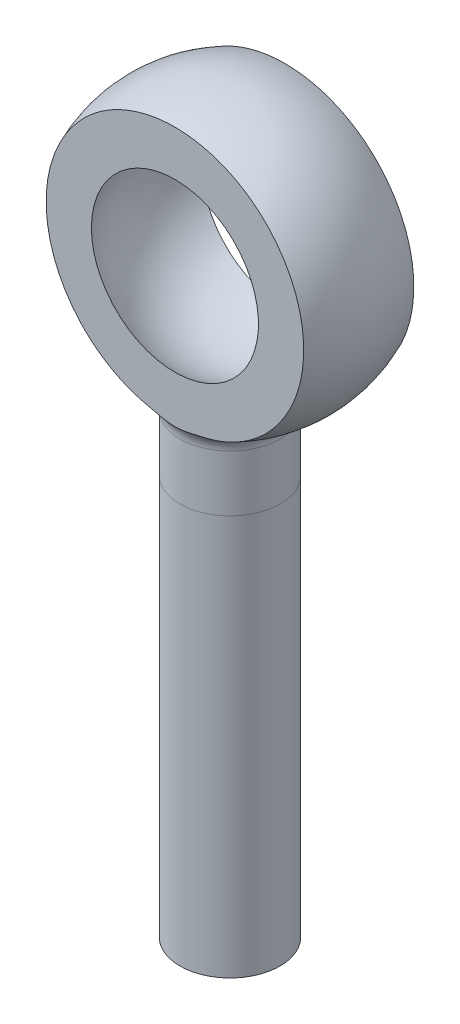
ISO-10303-21;
HEADER;
FILE_DESCRIPTION(('STEP AP214'),'2;1');
FILE_NAME('part.step','',(''),(''),'','','');
FILE_SCHEMA(('AUTOMOTIVE_DESIGN { 1 0 10303 214 1 1 1 1 }'));
ENDSEC;
DATA;
#1=APPLICATION_CONTEXT('core data for automotive mechanical design processes');
#2=APPLICATION_PROTOCOL_DEFINITION('international standard','automotive_design',2000,#1);
#3=PRODUCT_CONTEXT('',#1,'mechanical');
#4=PRODUCT('Part','Part','',(#3));
#5=PRODUCT_RELATED_PRODUCT_CATEGORY('part','',(#4));
#6=PRODUCT_DEFINITION_FORMATION('','',#4);
#7=PRODUCT_DEFINITION_CONTEXT('part definition',#1,'design');
#8=PRODUCT_DEFINITION('design','',#6,#7);
#9=PRODUCT_DEFINITION_SHAPE('','',#8);
#10=(LENGTH_UNIT() NAMED_UNIT(*) SI_UNIT(.MILLI.,.METRE.));
#11=(NAMED_UNIT(*) PLANE_ANGLE_UNIT() SI_UNIT($,.RADIAN.));
#12=(NAMED_UNIT(*) SI_UNIT($,.STERADIAN.) SOLID_ANGLE_UNIT());
#13=UNCERTAINTY_MEASURE_WITH_UNIT(LENGTH_MEASURE(1.E-05),#10,'distance_accuracy_value','');
#14=(GEOMETRIC_REPRESENTATION_CONTEXT(3) GLOBAL_UNCERTAINTY_ASSIGNED_CONTEXT((#13)) GLOBAL_UNIT_ASSIGNED_CONTEXT((#10,
#11,#12)) REPRESENTATION_CONTEXT('',''));
#15=CARTESIAN_POINT('',(0.,0.,0.));
#16=DIRECTION('',(0.,0.,1.));
#17=DIRECTION('',(1.,0.,0.));
#18=AXIS2_PLACEMENT_3D('',#15,#16,#17);
#19=CARTESIAN_POINT('',(0.,11.1135,0.));
#20=DIRECTION('',(0.,-1.,0.));
#21=DIRECTION('',(0.,0.,-1.));
#22=AXIS2_PLACEMENT_3D('',#19,#20,#21);
#23=CYLINDRICAL_SURFACE('',#22,3.96875);
#24=CARTESIAN_POINT('',(0.,-47.625,0.));
#25=DIRECTION('',(0.,1.,0.));
#26=DIRECTION('',(0.,0.,1.));
#27=AXIS2_PLACEMENT_3D('',#24,#25,#26);
#28=CIRCLE('',#27,3.96875);
#29=CARTESIAN_POINT('',(0.,-47.625,3.96875));
#30=VERTEX_POINT('',#29);
#31=EDGE_CURVE('E78',#30,#30,#28,.T.);
#32=ORIENTED_EDGE('',*,*,#31,.T.);
#33=EDGE_LOOP('',(#32));
#34=FACE_BOUND('',#33,.T.);
#35=CARTESIAN_POINT('',(0.,-15.875,0.));
#36=DIRECTION('',(0.,1.,0.));
#37=DIRECTION('',(0.,0.,1.));
#38=AXIS2_PLACEMENT_3D('',#35,#36,#37);
#39=CIRCLE('',#38,3.96875);
#40=CARTESIAN_POINT('',(0.,-15.875,3.96875));
#41=VERTEX_POINT('',#40);
#42=EDGE_CURVE('E11',#41,#41,#39,.T.);
#43=ORIENTED_EDGE('',*,*,#42,.F.);
#44=EDGE_LOOP('',(#43));
#45=FACE_BOUND('',#44,.T.);
#46=ADVANCED_FACE('F33',(#34,#45),#23,.T.);
#47=CARTESIAN_POINT('',(0.,0.,0.));
#48=DIRECTION('',(0.,-1.,0.));
#49=DIRECTION('',(1.,0.,0.));
#50=AXIS2_PLACEMENT_3D('',#47,#48,#49);
#51=SPHERICAL_SURFACE('',#50,11.1125);
#52=CARTESIAN_POINT('',(0.,-9.99256458802736,0.));
#53=DIRECTION('',(0.,1.,0.));
#54=DIRECTION('',(0.,0.,1.));
#55=AXIS2_PLACEMENT_3D('',#52,#53,#54);
#56=CIRCLE('',#55,4.86171875);
#57=CARTESIAN_POINT('',(-2.13304846735876,-9.99256458802736,-4.3688));
#58=VERTEX_POINT('',#57);
#59=CARTESIAN_POINT('',(-2.13304846735876,-9.99256458802736,4.3688));
#60=VERTEX_POINT('',#59);
#61=EDGE_CURVE('E43',#58,#60,#56,.T.);
#62=ORIENTED_EDGE('',*,*,#61,.T.);
#63=CARTESIAN_POINT('',(0.,0.,4.3688));
#64=DIRECTION('',(0.,0.,-1.));
#65=DIRECTION('',(-1.,0.,0.));
#66=AXIS2_PLACEMENT_3D('',#63,#64,#65);
#67=CIRCLE('',#66,10.2176926363049);
#68=CARTESIAN_POINT('',(2.13304846735876,-9.99256458802736,4.3688));
#69=VERTEX_POINT('',#68);
#70=EDGE_CURVE('E49',#60,#69,#67,.T.);
#71=ORIENTED_EDGE('',*,*,#70,.T.);
#72=CARTESIAN_POINT('',(2.13304846735876,-9.99256458802736,-4.3688));
#73=VERTEX_POINT('',#72);
#74=EDGE_CURVE('E56',#69,#73,#56,.T.);
#75=ORIENTED_EDGE('',*,*,#74,.T.);
#76=CARTESIAN_POINT('',(0.,0.,-4.3688));
#77=DIRECTION('',(0.,0.,1.));
#78=DIRECTION('',(1.,0.,0.));
#79=AXIS2_PLACEMENT_3D('',#76,#77,#78);
#80=CIRCLE('',#79,10.2176926363049);
#81=EDGE_CURVE('E132',#73,#58,#80,.T.);
#82=ORIENTED_EDGE('',*,*,#81,.T.);
#83=EDGE_LOOP('',(#62,#71,#75,#82));
#84=FACE_BOUND('',#83,.T.);
#85=ADVANCED_FACE('F69',(#84),#51,.T.);
#86=ORIENTED_EDGE('',*,*,#42,.T.);
#87=EDGE_LOOP('',(#86));
#88=FACE_BOUND('',#87,.T.);
#89=CARTESIAN_POINT('',(0.,-11.4200738148884,0.));
#90=DIRECTION('',(0.,1.,0.));
#91=DIRECTION('',(0.,0.,1.));
#92=AXIS2_PLACEMENT_3D('',#89,#90,#91);
#93=CIRCLE('',#92,3.96875);
#94=CARTESIAN_POINT('',(0.,-11.4200738148884,3.96875));
#95=VERTEX_POINT('',#94);
#96=EDGE_CURVE('E75',#95,#95,#93,.F.);
#97=ORIENTED_EDGE('',*,*,#96,.T.);
#98=EDGE_LOOP('',(#97));
#99=FACE_BOUND('',#98,.T.);
#100=ADVANCED_FACE('F100',(#88,#99),#23,.T.);
#101=CARTESIAN_POINT('',(0.,-47.625,0.));
#102=DIRECTION('',(0.,1.,0.));
#103=DIRECTION('',(0.,0.,1.));
#104=AXIS2_PLACEMENT_3D('',#101,#102,#103);
#105=PLANE('',#104);
#106=ORIENTED_EDGE('',*,*,#31,.F.);
#107=EDGE_LOOP('',(#106));
#108=FACE_BOUND('',#107,.T.);
#109=ADVANCED_FACE('F109',(#108),#105,.F.);
#110=CARTESIAN_POINT('',(0.,-11.4200738148884,0.));
#111=DIRECTION('',(0.,1.,0.));
#112=DIRECTION('',(0.,0.,1.));
#113=AXIS2_PLACEMENT_3D('',#110,#111,#112);
#114=TOROIDAL_SURFACE('',#113,5.55625,1.5875);
#115=ORIENTED_EDGE('',*,*,#74,.F.);
#116=CARTESIAN_POINT('',(0.,-10.3664520860407,4.3688));
#117=CARTESIAN_POINT('',(-0.0726097240498486,-10.3664573067879,4.3688));
#118=CARTESIAN_POINT('',(-0.145213118950749,-10.3643980280305,4.3688));
#119=CARTESIAN_POINT('',(-0.290206118978634,-10.3563495762766,4.3688));
#120=CARTESIAN_POINT('',(-0.362595700810238,-10.3503599898575,4.3688));
#121=CARTESIAN_POINT('',(-0.579547925017426,-10.3270979445272,4.3688));
#122=CARTESIAN_POINT('',(-0.723534377132135,-10.304535777483,4.3688));
#123=CARTESIAN_POINT('',(-1.01235068782425,-10.2503532361437,4.3688));
#124=CARTESIAN_POINT('',(-1.15714826594501,-10.2185755951878,4.3688));
#125=CARTESIAN_POINT('',(-1.4458760076199,-10.1519613683551,4.3688));
#126=CARTESIAN_POINT('',(-1.5898067729567,-10.1171272525233,4.3688));
#127=CARTESIAN_POINT('',(-1.88336382291367,-10.0477989083918,4.3688));
#128=CARTESIAN_POINT('',(-2.03300587111503,-10.0133637157854,4.3688));
#129=CARTESIAN_POINT('',(-2.33355404774908,-9.95054289068798,4.3688));
#130=CARTESIAN_POINT('',(-2.48446071136984,-9.92215996946775,4.3688));
#131=CARTESIAN_POINT('',(-2.93648023819684,-9.85253925716706,4.3688));
#132=CARTESIAN_POINT('',(-3.24062822955834,-9.82573776245045,4.3688));
#133=CARTESIAN_POINT('',(-3.6769915806545,-9.83774472619492,4.3688));
#134=CARTESIAN_POINT('',(-3.80987191493173,-9.8481668469335,4.3688));
#135=CARTESIAN_POINT('',(-4.07384562707482,-9.8854988906792,4.3688));
#136=CARTESIAN_POINT('',(-4.20493266157021,-9.91245682091621,4.3688));
#137=CARTESIAN_POINT('',(-4.46313869176347,-9.98626860579402,4.3688));
#138=CARTESIAN_POINT('',(-4.59019753900849,-10.0333398489889,4.3688));
#139=CARTESIAN_POINT('',(-4.83339328619368,-10.1501109535123,4.3688));
#140=CARTESIAN_POINT('',(-4.94956575816893,-10.2197335473519,4.3688));
#141=CARTESIAN_POINT('',(-5.12613585560653,-10.3542209834351,4.3688));
#142=CARTESIAN_POINT('',(-5.19180229601023,-10.4121857719334,4.3688));
#143=CARTESIAN_POINT('',(-5.31300705472184,-10.5379861621544,4.3688));
#144=CARTESIAN_POINT('',(-5.36854817538428,-10.6058190233465,4.3688));
#145=CARTESIAN_POINT('',(-5.46711361642322,-10.7509471565449,4.3688));
#146=CARTESIAN_POINT('',(-5.51003207551035,-10.8283151412905,4.3688));
#147=CARTESIAN_POINT('',(-5.5799656949474,-10.9899542373251,4.3688));
#148=CARTESIAN_POINT('',(-5.60699511611798,-11.0742190808679,4.3688));
#149=CARTESIAN_POINT('',(-5.64082513352901,-11.2352821106631,4.3688));
#150=CARTESIAN_POINT('',(-5.64979816330322,-11.3116274513772,4.3688));
#151=CARTESIAN_POINT('',(-5.65368138311477,-11.4646605220079,4.3688));
#152=CARTESIAN_POINT('',(-5.64859811289931,-11.5413480761333,4.3688));
#153=CARTESIAN_POINT('',(-5.62558138875317,-11.6869659944006,4.3688));
#154=CARTESIAN_POINT('',(-5.60861702913061,-11.7560529616344,4.3688));
#155=CARTESIAN_POINT('',(-5.56377038655413,-11.8905697022908,4.3688));
#156=CARTESIAN_POINT('',(-5.53588682722717,-11.9559990471423,4.3688));
#157=CARTESIAN_POINT('',(-5.46912287513845,-12.0843822802058,4.3688));
#158=CARTESIAN_POINT('',(-5.42983867272598,-12.1471248573844,4.3688));
#159=CARTESIAN_POINT('',(-5.34247234969647,-12.2660912762876,4.3688));
#160=CARTESIAN_POINT('',(-5.29438936731948,-12.3223144786173,4.3688));
#161=CARTESIAN_POINT('',(-5.18421657107587,-12.4347107931678,4.3688));
#162=CARTESIAN_POINT('',(-5.12111489607715,-12.4898888614347,4.3688));
#163=CARTESIAN_POINT('',(-4.98790082669363,-12.5910730708791,4.3688));
#164=CARTESIAN_POINT('',(-4.91777768435069,-12.637064817836,4.3688));
#165=CARTESIAN_POINT('',(-4.73097256822164,-12.7437229251406,4.3688));
#166=CARTESIAN_POINT('',(-4.61051068614924,-12.797838692947,4.3688));
#167=CARTESIAN_POINT('',(-4.42485814422583,-12.8639106010932,4.3688));
#168=CARTESIAN_POINT('',(-4.36214278162483,-12.8834184497696,4.3688));
#169=CARTESIAN_POINT('',(-4.23544549898304,-12.9177982572151,4.3688));
#170=CARTESIAN_POINT('',(-4.17146373977643,-12.9326708007077,4.3688));
#171=CARTESIAN_POINT('',(-4.00860896565014,-12.9648457904108,4.3688));
#172=CARTESIAN_POINT('',(-3.90916920619035,-12.9792773843941,4.3688));
#173=CARTESIAN_POINT('',(-3.70937555928365,-12.9993650380916,4.3688));
#174=CARTESIAN_POINT('',(-3.60902097790907,-13.0050137606115,4.3688));
#175=CARTESIAN_POINT('',(-3.40742432102585,-13.0087546085583,4.3688));
#176=CARTESIAN_POINT('',(-3.30618135971802,-13.0067882378857,4.3688));
#177=CARTESIAN_POINT('',(-3.10409908929358,-12.9963710705444,4.3688));
#178=CARTESIAN_POINT('',(-3.0032596325476,-12.9879229156592,4.3688));
#179=CARTESIAN_POINT('',(-2.7030749447869,-12.9547244500574,4.3688));
#180=CARTESIAN_POINT('',(-2.50461441496196,-12.9221133898798,4.3688));
#181=CARTESIAN_POINT('',(-2.20872045151247,-12.8639931663845,4.3688));
#182=CARTESIAN_POINT('',(-2.11027695957749,-12.8430565648596,4.3688));
#183=CARTESIAN_POINT('',(-1.91381193718433,-12.7992727812516,4.3688));
#184=CARTESIAN_POINT('',(-1.81579038681626,-12.7764256903802,4.3688));
#185=CARTESIAN_POINT('',(-1.62065284912657,-12.7302634259238,4.3688));
#186=CARTESIAN_POINT('',(-1.52353564743954,-12.7069531380381,4.3688));
#187=CARTESIAN_POINT('',(-1.32910855808886,-12.6610972074725,4.3688));
#188=CARTESIAN_POINT('',(-1.23179865766673,-12.6385516173452,4.3688));
#189=CARTESIAN_POINT('',(-1.03690645941627,-12.5958993947952,4.3688));
#190=CARTESIAN_POINT('',(-0.93932560263085,-12.5757863526432,4.3688));
#191=CARTESIAN_POINT('',(-0.743377550256177,-12.5397286233878,4.3688));
#192=CARTESIAN_POINT('',(-0.645010413118306,-12.5237836293514,4.3688));
#193=CARTESIAN_POINT('',(-0.44680655447947,-12.4977875272205,4.3688));
#194=CARTESIAN_POINT('',(-0.346964420452929,-12.4877759474486,4.3688));
#195=CARTESIAN_POINT('',(-0.14681667025984,-12.4752232036091,4.3688));
#196=CARTESIAN_POINT('',(-0.0465111946085389,-12.4726799067948,4.3688));
#197=CARTESIAN_POINT('',(0.154072627593539,-12.4754570575365,4.3688));
#198=CARTESIAN_POINT('',(0.254350874293508,-12.4807843612341,4.3688));
#199=CARTESIAN_POINT('',(0.454285232362635,-12.4985027879329,4.3688));
#200=CARTESIAN_POINT('',(0.553941119824627,-12.5108963200848,4.3688));
#201=CARTESIAN_POINT('',(0.753285547906553,-12.5412447036127,4.3688));
#202=CARTESIAN_POINT('',(0.852966322828298,-12.5592485649284,4.3688));
#203=CARTESIAN_POINT('',(1.05159119225228,-12.5988426006486,4.3688));
#204=CARTESIAN_POINT('',(1.15053527198526,-12.6204328467516,4.3688));
#205=CARTESIAN_POINT('',(1.34808201719085,-12.665395873766,4.3688));
#206=CARTESIAN_POINT('',(1.44668438452982,-12.6887699306102,4.3688));
#207=CARTESIAN_POINT('',(1.64383920397144,-12.7356912953812,4.3688));
#208=CARTESIAN_POINT('',(1.74239165943852,-12.7592385892866,4.3688));
#209=CARTESIAN_POINT('',(1.91194607726653,-12.7986554198153,4.3688));
#210=CARTESIAN_POINT('',(1.98287916664586,-12.8148173437837,4.3688));
#211=CARTESIAN_POINT('',(2.12497127050404,-12.8460534865833,4.3688));
#212=CARTESIAN_POINT('',(2.19613023607153,-12.8611279260851,4.3688));
#213=CARTESIAN_POINT('',(2.33851139254139,-12.8897044738403,4.3688));
#214=CARTESIAN_POINT('',(2.40973251276928,-12.903211841969,4.3688));
#215=CARTESIAN_POINT('',(2.55251507172897,-12.9282954740155,4.3688));
#216=CARTESIAN_POINT('',(2.62407651863542,-12.9398716913035,4.3688));
#217=CARTESIAN_POINT('',(2.83885203848685,-12.9710238473913,4.3688));
#218=CARTESIAN_POINT('',(2.9826024757824,-12.9871178172971,4.3688));
#219=CARTESIAN_POINT('',(3.27111653326634,-13.0066873884271,4.3688));
#220=CARTESIAN_POINT('',(3.41588031549846,-13.0101609230984,4.3688));
#221=CARTESIAN_POINT('',(3.62826173077087,-13.0034240494875,4.3688));
#222=CARTESIAN_POINT('',(3.69608855254657,-12.9994922657003,4.3688));
#223=CARTESIAN_POINT('',(3.83137365950129,-12.9876965892092,4.3688));
#224=CARTESIAN_POINT('',(3.89883205221477,-12.9798339135026,4.3688));
#225=CARTESIAN_POINT('',(4.10092010665107,-12.9496606631979,4.3688));
#226=CARTESIAN_POINT('',(4.23467789389491,-12.9207763746134,4.3688));
#227=CARTESIAN_POINT('',(4.49777708895544,-12.8419220500484,4.3688));
#228=CARTESIAN_POINT('',(4.62704492289873,-12.791699636522,4.3688));
#229=CARTESIAN_POINT('',(4.87329376345525,-12.667380027063,4.3688));
#230=CARTESIAN_POINT('',(4.99033241636942,-12.593402228351,4.3688));
#231=CARTESIAN_POINT('',(5.16409467762445,-12.4529721197081,4.3688));
#232=CARTESIAN_POINT('',(5.22697539075623,-12.394105202614,4.3688));
#233=CARTESIAN_POINT('',(5.34249001229086,-12.2669162129203,4.3688));
#234=CARTESIAN_POINT('',(5.39512315497446,-12.1985934344117,4.3688));
#235=CARTESIAN_POINT('',(5.48779598450905,-12.0530613412514,4.3688));
#236=CARTESIAN_POINT('',(5.52773652733017,-11.9757882046569,4.3688));
#237=CARTESIAN_POINT('',(5.59190102185606,-11.8149635923329,4.3688));
#238=CARTESIAN_POINT('',(5.61613989687868,-11.7314181625147,4.3688));
#239=CARTESIAN_POINT('',(5.64524544716315,-11.5717330597377,4.3688));
#240=CARTESIAN_POINT('',(5.6521418159697,-11.4959599043637,4.3688));
#241=CARTESIAN_POINT('',(5.65214950563866,-11.344423289569,4.3688));
#242=CARTESIAN_POINT('',(5.6452656180502,-11.2686598359354,4.3688));
#243=CARTESIAN_POINT('',(5.61902119184314,-11.1244120352236,4.3688));
#244=CARTESIAN_POINT('',(5.60049346852774,-11.0557732749188,4.3688));
#245=CARTESIAN_POINT('',(5.55269115284231,-10.9223741505348,4.3688));
#246=CARTESIAN_POINT('',(5.52341629291789,-10.857613883059,4.3688));
#247=CARTESIAN_POINT('',(5.45378695833586,-10.7303154304512,4.3688));
#248=CARTESIAN_POINT('',(5.4129690870731,-10.6680321185813,4.3688));
#249=CARTESIAN_POINT('',(5.3226534966221,-10.5501434011257,4.3688));
#250=CARTESIAN_POINT('',(5.27315100415914,-10.4945416963751,4.3688));
#251=CARTESIAN_POINT('',(5.14627427336848,-10.3700564160988,4.3688));
#252=CARTESIAN_POINT('',(5.06559036616946,-10.3045360518776,4.3688));
#253=CARTESIAN_POINT('',(4.89462131574608,-10.1875276758924,4.3688));
#254=CARTESIAN_POINT('',(4.80431852007648,-10.1360661034665,4.3688));
#255=CARTESIAN_POINT('',(4.58299403993577,-10.0299980832966,4.3688));
#256=CARTESIAN_POINT('',(4.44920705490563,-9.98119006638124,4.3688));
#257=CARTESIAN_POINT('',(4.17579177646061,-9.90540529616104,4.3688));
#258=CARTESIAN_POINT('',(4.03615904594427,-9.87844545424215,4.3688));
#259=CARTESIAN_POINT('',(3.78198527988193,-9.84622838273387,4.3688));
#260=CARTESIAN_POINT('',(3.6678153999217,-9.83778182225799,4.3688));
#261=CARTESIAN_POINT('',(3.43911143444932,-9.83093245109522,4.3688));
#262=CARTESIAN_POINT('',(3.32457711471699,-9.83253861804913,4.3688));
#263=CARTESIAN_POINT('',(3.0952382824899,-9.84411061244912,4.3688));
#264=CARTESIAN_POINT('',(2.98043675880277,-9.85413006183416,4.3688));
#265=CARTESIAN_POINT('',(2.75175773543751,-9.88089352788032,4.3688));
#266=CARTESIAN_POINT('',(2.63787948799971,-9.89763139835146,4.3688));
#267=CARTESIAN_POINT('',(2.41800569049414,-9.93499431792496,4.3688));
#268=CARTESIAN_POINT('',(2.31195706041955,-9.95531604012069,4.3688));
#269=CARTESIAN_POINT('',(2.10049506675081,-9.99904961020297,4.3688));
#270=CARTESIAN_POINT('',(1.99508180428828,-10.022461937113,4.3688));
#271=CARTESIAN_POINT('',(1.78434077895125,-10.0709695111509,4.3688));
#272=CARTESIAN_POINT('',(1.6790140838978,-10.096069291452,4.3688));
#273=CARTESIAN_POINT('',(1.46835022454945,-10.1462328581349,4.3688));
#274=CARTESIAN_POINT('',(1.36301306012598,-10.1712966439949,4.3688));
#275=CARTESIAN_POINT('',(1.15386230564523,-10.2190089264185,4.3688));
#276=CARTESIAN_POINT('',(1.05005728990334,-10.2416939641056,4.3688));
#277=CARTESIAN_POINT('',(0.841627554052664,-10.2830711047396,4.3688));
#278=CARTESIAN_POINT('',(0.737002853776258,-10.3017633039864,4.3688));
#279=CARTESIAN_POINT('',(0.527294428043935,-10.332844516394,4.3688));
#280=CARTESIAN_POINT('',(0.422215323861041,-10.3452633851296,4.3688));
#281=CARTESIAN_POINT('',(0.211419482180753,-10.3620616633604,4.3688));
#282=CARTESIAN_POINT('',(0.105703034517339,-10.3664444858352,4.3688));
#283=CARTESIAN_POINT('',(0.,-10.3664520860407,4.3688));
#284=B_SPLINE_CURVE_WITH_KNOTS('',3,(#116,#117,#118,#119,#120,#121,#122,#123,#124,#125,#126,
#127,#128,#129,#130,#131,#132,#133,#134,#135,#136,#137,#138,#139,#140,#141,#142,#143,#144,#145,
#146,#147,#148,#149,#150,#151,#152,#153,#154,#155,#156,#157,#158,#159,#160,#161,#162,#163,#164,
#165,#166,#167,#168,#169,#170,#171,#172,#173,#174,#175,#176,#177,#178,#179,#180,#181,#182,#183,
#184,#185,#186,#187,#188,#189,#190,#191,#192,#193,#194,#195,#196,#197,#198,#199,#200,#201,#202,
#203,#204,#205,#206,#207,#208,#209,#210,#211,#212,#213,#214,#215,#216,#217,#218,#219,#220,#221,
#222,#223,#224,#225,#226,#227,#228,#229,#230,#231,#232,#233,#234,#235,#236,#237,#238,#239,#240,
#241,#242,#243,#244,#245,#246,#247,#248,#249,#250,#251,#252,#253,#254,#255,#256,#257,#258,#259,
#260,#261,#262,#263,#264,#265,#266,#267,#268,#269,#270,#271,#272,#273,#274,#275,#276,#277,#278,
#279,#280,#281,#282,#283),.UNSPECIFIED.,.T.,.F.,(4,2,2,2,2,2,2,2,2,2,2,2,2,2,2,2,2,2,2,2,2,2,2,
2,2,2,2,2,2,2,2,2,2,2,2,2,2,2,2,2,2,2,2,2,2,2,2,2,2,2,2,2,2,2,2,2,2,2,2,2,2,2,2,2,2,2,2,2,2,2,2,
2,2,2,2,2,2,2,2,2,2,2,2,4),(0.,0.217790635198876,0.435604183104528,0.872304985224865,
1.31694742153483,1.76123377910725,2.2217707783135,2.68251365549705,3.59235373336899,
3.99141123032611,4.39163280208411,4.79629403927282,5.19958320108091,5.46138688994416,
5.72311800981096,5.98698536179304,6.25061552300449,6.47998407683024,6.70924593401875,
6.92170519064707,7.13418928959524,7.35538064451344,7.57659367470636,7.82713723013442,
8.07807033927926,8.4718517462613,8.66877001083447,8.86566342496611,9.16662941057904,
9.46784668778203,9.77138236815837,10.0747944020467,10.6772971450592,10.9792405043094,
11.2811694562448,11.5808005560897,11.8804522060616,12.1792962317932,12.4781182445947,
12.7789092571933,13.0796143633652,13.3805815706013,13.681651450613,13.985428813204,
14.2892122496133,14.593215051904,14.8971935137722,15.1154410873738,15.333644249237,
15.5510924171146,15.7685458347488,16.2020896070624,16.6357043674786,16.8394230701713,
17.0430787409324,17.4521330978457,17.866166489577,18.2781506458176,18.5356036101086,
18.7930758044302,19.0525123544481,19.3117019653022,19.5387474527888,19.7657140077353,
19.9780508556987,20.1903929902337,20.412902505011,20.6355347016632,20.9456273763327,
21.2562992666638,21.6811785953714,22.1063864848736,22.4493425831563,22.7926050038513,
23.1380719562893,23.4832235840807,23.8070927662836,24.131012205159,24.4558395681187,
24.7806715938887,25.0993984912168,25.4181177005773,25.73530544687,26.0523584494977),.UNSPECIFIED.);
#285=EDGE_CURVE('E62',#69,#60,#284,.T.);
#286=ORIENTED_EDGE('',*,*,#285,.T.);
#287=ORIENTED_EDGE('',*,*,#61,.F.);
#288=CARTESIAN_POINT('',(0.,-10.3664520860407,-4.3688));
#289=CARTESIAN_POINT('',(0.0726097240498486,-10.3664573067879,-4.3688));
#290=CARTESIAN_POINT('',(0.145213118950749,-10.3643980280305,-4.3688));
#291=CARTESIAN_POINT('',(0.290206118978634,-10.3563495762766,-4.3688));
#292=CARTESIAN_POINT('',(0.362595700810238,-10.3503599898575,-4.3688));
#293=CARTESIAN_POINT('',(0.579547925017426,-10.3270979445272,-4.3688));
#294=CARTESIAN_POINT('',(0.723534377132135,-10.304535777483,-4.3688));
#295=CARTESIAN_POINT('',(1.01235068782425,-10.2503532361437,-4.3688));
#296=CARTESIAN_POINT('',(1.15714826594501,-10.2185755951878,-4.3688));
#297=CARTESIAN_POINT('',(1.4458760076199,-10.1519613683551,-4.3688));
#298=CARTESIAN_POINT('',(1.5898067729567,-10.1171272525233,-4.3688));
#299=CARTESIAN_POINT('',(1.88336382291367,-10.0477989083918,-4.3688));
#300=CARTESIAN_POINT('',(2.03300587111503,-10.0133637157854,-4.3688));
#301=CARTESIAN_POINT('',(2.33355404774908,-9.95054289068798,-4.3688));
#302=CARTESIAN_POINT('',(2.48446071136984,-9.92215996946775,-4.3688));
#303=CARTESIAN_POINT('',(2.93648023819684,-9.85253925716706,-4.3688));
#304=CARTESIAN_POINT('',(3.24062822955834,-9.82573776245045,-4.3688));
#305=CARTESIAN_POINT('',(3.6769915806545,-9.83774472619492,-4.3688));
#306=CARTESIAN_POINT('',(3.80987191493173,-9.8481668469335,-4.3688));
#307=CARTESIAN_POINT('',(4.07384562707482,-9.8854988906792,-4.3688));
#308=CARTESIAN_POINT('',(4.20493266157021,-9.91245682091621,-4.3688));
#309=CARTESIAN_POINT('',(4.46313869176347,-9.98626860579402,-4.3688));
#310=CARTESIAN_POINT('',(4.59019753900849,-10.0333398489889,-4.3688));
#311=CARTESIAN_POINT('',(4.83339328619368,-10.1501109535123,-4.3688));
#312=CARTESIAN_POINT('',(4.94956575816893,-10.2197335473519,-4.3688));
#313=CARTESIAN_POINT('',(5.12613585560653,-10.3542209834351,-4.3688));
#314=CARTESIAN_POINT('',(5.19180229601023,-10.4121857719334,-4.3688));
#315=CARTESIAN_POINT('',(5.31300705472184,-10.5379861621544,-4.3688));
#316=CARTESIAN_POINT('',(5.36854817538428,-10.6058190233465,-4.3688));
#317=CARTESIAN_POINT('',(5.46711361642322,-10.7509471565449,-4.3688));
#318=CARTESIAN_POINT('',(5.51003207551035,-10.8283151412905,-4.3688));
#319=CARTESIAN_POINT('',(5.5799656949474,-10.9899542373251,-4.3688));
#320=CARTESIAN_POINT('',(5.60699511611798,-11.0742190808679,-4.3688));
#321=CARTESIAN_POINT('',(5.64082513352901,-11.2352821106631,-4.3688));
#322=CARTESIAN_POINT('',(5.64979816330322,-11.3116274513772,-4.3688));
#323=CARTESIAN_POINT('',(5.65368138311477,-11.4646605220079,-4.3688));
#324=CARTESIAN_POINT('',(5.64859811289931,-11.5413480761333,-4.3688));
#325=CARTESIAN_POINT('',(5.62558138875317,-11.6869659944006,-4.3688));
#326=CARTESIAN_POINT('',(5.60861702913061,-11.7560529616344,-4.3688));
#327=CARTESIAN_POINT('',(5.56377038655413,-11.8905697022908,-4.3688));
#328=CARTESIAN_POINT('',(5.53588682722717,-11.9559990471423,-4.3688));
#329=CARTESIAN_POINT('',(5.46912287513845,-12.0843822802058,-4.3688));
#330=CARTESIAN_POINT('',(5.42983867272598,-12.1471248573844,-4.3688));
#331=CARTESIAN_POINT('',(5.34247234969647,-12.2660912762876,-4.3688));
#332=CARTESIAN_POINT('',(5.29438936731948,-12.3223144786173,-4.3688));
#333=CARTESIAN_POINT('',(5.18421657107587,-12.4347107931678,-4.3688));
#334=CARTESIAN_POINT('',(5.12111489607715,-12.4898888614347,-4.3688));
#335=CARTESIAN_POINT('',(4.98790082669363,-12.5910730708791,-4.3688));
#336=CARTESIAN_POINT('',(4.91777768435069,-12.637064817836,-4.3688));
#337=CARTESIAN_POINT('',(4.73097256822164,-12.7437229251406,-4.3688));
#338=CARTESIAN_POINT('',(4.61051068614924,-12.797838692947,-4.3688));
#339=CARTESIAN_POINT('',(4.42485814422583,-12.8639106010932,-4.3688));
#340=CARTESIAN_POINT('',(4.36214278162483,-12.8834184497696,-4.3688));
#341=CARTESIAN_POINT('',(4.23544549898304,-12.9177982572151,-4.3688));
#342=CARTESIAN_POINT('',(4.17146373977643,-12.9326708007077,-4.3688));
#343=CARTESIAN_POINT('',(4.00860896565014,-12.9648457904108,-4.3688));
#344=CARTESIAN_POINT('',(3.90916920619035,-12.9792773843941,-4.3688));
#345=CARTESIAN_POINT('',(3.70937555928365,-12.9993650380916,-4.3688));
#346=CARTESIAN_POINT('',(3.60902097790907,-13.0050137606115,-4.3688));
#347=CARTESIAN_POINT('',(3.40742432102585,-13.0087546085583,-4.3688));
#348=CARTESIAN_POINT('',(3.30618135971802,-13.0067882378857,-4.3688));
#349=CARTESIAN_POINT('',(3.10409908929358,-12.9963710705444,-4.3688));
#350=CARTESIAN_POINT('',(3.0032596325476,-12.9879229156592,-4.3688));
#351=CARTESIAN_POINT('',(2.7030749447869,-12.9547244500574,-4.3688));
#352=CARTESIAN_POINT('',(2.50461441496196,-12.9221133898798,-4.3688));
#353=CARTESIAN_POINT('',(2.20872045151247,-12.8639931663845,-4.3688));
#354=CARTESIAN_POINT('',(2.11027695957749,-12.8430565648596,-4.3688));
#355=CARTESIAN_POINT('',(1.91381193718433,-12.7992727812516,-4.3688));
#356=CARTESIAN_POINT('',(1.81579038681626,-12.7764256903802,-4.3688));
#357=CARTESIAN_POINT('',(1.62065284912657,-12.7302634259238,-4.3688));
#358=CARTESIAN_POINT('',(1.52353564743954,-12.7069531380381,-4.3688));
#359=CARTESIAN_POINT('',(1.32910855808886,-12.6610972074725,-4.3688));
#360=CARTESIAN_POINT('',(1.23179865766673,-12.6385516173452,-4.3688));
#361=CARTESIAN_POINT('',(1.03690645941627,-12.5958993947952,-4.3688));
#362=CARTESIAN_POINT('',(0.93932560263085,-12.5757863526432,-4.3688));
#363=CARTESIAN_POINT('',(0.743377550256177,-12.5397286233878,-4.3688));
#364=CARTESIAN_POINT('',(0.645010413118306,-12.5237836293514,-4.3688));
#365=CARTESIAN_POINT('',(0.44680655447947,-12.4977875272205,-4.3688));
#366=CARTESIAN_POINT('',(0.346964420452929,-12.4877759474486,-4.3688));
#367=CARTESIAN_POINT('',(0.14681667025984,-12.4752232036091,-4.3688));
#368=CARTESIAN_POINT('',(0.0465111946085389,-12.4726799067948,-4.3688));
#369=CARTESIAN_POINT('',(-0.154072627593539,-12.4754570575365,-4.3688));
#370=CARTESIAN_POINT('',(-0.254350874293508,-12.4807843612341,-4.3688));
#371=CARTESIAN_POINT('',(-0.454285232362635,-12.4985027879329,-4.3688));
#372=CARTESIAN_POINT('',(-0.553941119824627,-12.5108963200848,-4.3688));
#373=CARTESIAN_POINT('',(-0.753285547906553,-12.5412447036127,-4.3688));
#374=CARTESIAN_POINT('',(-0.852966322828298,-12.5592485649284,-4.3688));
#375=CARTESIAN_POINT('',(-1.05159119225228,-12.5988426006486,-4.3688));
#376=CARTESIAN_POINT('',(-1.15053527198526,-12.6204328467516,-4.3688));
#377=CARTESIAN_POINT('',(-1.34808201719085,-12.665395873766,-4.3688));
#378=CARTESIAN_POINT('',(-1.44668438452982,-12.6887699306102,-4.3688));
#379=CARTESIAN_POINT('',(-1.64383920397144,-12.7356912953812,-4.3688));
#380=CARTESIAN_POINT('',(-1.74239165943852,-12.7592385892866,-4.3688));
#381=CARTESIAN_POINT('',(-1.91194607726653,-12.7986554198153,-4.3688));
#382=CARTESIAN_POINT('',(-1.98287916664586,-12.8148173437837,-4.3688));
#383=CARTESIAN_POINT('',(-2.12497127050404,-12.8460534865833,-4.3688));
#384=CARTESIAN_POINT('',(-2.19613023607153,-12.8611279260851,-4.3688));
#385=CARTESIAN_POINT('',(-2.33851139254139,-12.8897044738403,-4.3688));
#386=CARTESIAN_POINT('',(-2.40973251276928,-12.903211841969,-4.3688));
#387=CARTESIAN_POINT('',(-2.55251507172897,-12.9282954740155,-4.3688));
#388=CARTESIAN_POINT('',(-2.62407651863542,-12.9398716913035,-4.3688));
#389=CARTESIAN_POINT('',(-2.83885203848685,-12.9710238473913,-4.3688));
#390=CARTESIAN_POINT('',(-2.9826024757824,-12.9871178172971,-4.3688));
#391=CARTESIAN_POINT('',(-3.27111653326634,-13.0066873884271,-4.3688));
#392=CARTESIAN_POINT('',(-3.41588031549846,-13.0101609230984,-4.3688));
#393=CARTESIAN_POINT('',(-3.62826173077087,-13.0034240494875,-4.3688));
#394=CARTESIAN_POINT('',(-3.69608855254657,-12.9994922657003,-4.3688));
#395=CARTESIAN_POINT('',(-3.83137365950129,-12.9876965892092,-4.3688));
#396=CARTESIAN_POINT('',(-3.89883205221477,-12.9798339135026,-4.3688));
#397=CARTESIAN_POINT('',(-4.10092010665107,-12.9496606631979,-4.3688));
#398=CARTESIAN_POINT('',(-4.23467789389491,-12.9207763746134,-4.3688));
#399=CARTESIAN_POINT('',(-4.49777708895544,-12.8419220500484,-4.3688));
#400=CARTESIAN_POINT('',(-4.62704492289873,-12.791699636522,-4.3688));
#401=CARTESIAN_POINT('',(-4.87329376345525,-12.667380027063,-4.3688));
#402=CARTESIAN_POINT('',(-4.99033241636942,-12.593402228351,-4.3688));
#403=CARTESIAN_POINT('',(-5.16409467762445,-12.4529721197081,-4.3688));
#404=CARTESIAN_POINT('',(-5.22697539075623,-12.394105202614,-4.3688));
#405=CARTESIAN_POINT('',(-5.34249001229086,-12.2669162129203,-4.3688));
#406=CARTESIAN_POINT('',(-5.39512315497446,-12.1985934344117,-4.3688));
#407=CARTESIAN_POINT('',(-5.48779598450905,-12.0530613412514,-4.3688));
#408=CARTESIAN_POINT('',(-5.52773652733017,-11.9757882046569,-4.3688));
#409=CARTESIAN_POINT('',(-5.59190102185606,-11.8149635923329,-4.3688));
#410=CARTESIAN_POINT('',(-5.61613989687868,-11.7314181625147,-4.3688));
#411=CARTESIAN_POINT('',(-5.64524544716315,-11.5717330597377,-4.3688));
#412=CARTESIAN_POINT('',(-5.6521418159697,-11.4959599043637,-4.3688));
#413=CARTESIAN_POINT('',(-5.65214950563866,-11.344423289569,-4.3688));
#414=CARTESIAN_POINT('',(-5.6452656180502,-11.2686598359354,-4.3688));
#415=CARTESIAN_POINT('',(-5.61902119184314,-11.1244120352236,-4.3688));
#416=CARTESIAN_POINT('',(-5.60049346852774,-11.0557732749188,-4.3688));
#417=CARTESIAN_POINT('',(-5.55269115284231,-10.9223741505348,-4.3688));
#418=CARTESIAN_POINT('',(-5.52341629291789,-10.857613883059,-4.3688));
#419=CARTESIAN_POINT('',(-5.45378695833586,-10.7303154304512,-4.3688));
#420=CARTESIAN_POINT('',(-5.4129690870731,-10.6680321185813,-4.3688));
#421=CARTESIAN_POINT('',(-5.3226534966221,-10.5501434011257,-4.3688));
#422=CARTESIAN_POINT('',(-5.27315100415914,-10.4945416963751,-4.3688));
#423=CARTESIAN_POINT('',(-5.14627427336848,-10.3700564160988,-4.3688));
#424=CARTESIAN_POINT('',(-5.06559036616946,-10.3045360518776,-4.3688));
#425=CARTESIAN_POINT('',(-4.89462131574608,-10.1875276758924,-4.3688));
#426=CARTESIAN_POINT('',(-4.80431852007648,-10.1360661034665,-4.3688));
#427=CARTESIAN_POINT('',(-4.58299403993577,-10.0299980832966,-4.3688));
#428=CARTESIAN_POINT('',(-4.44920705490563,-9.98119006638124,-4.3688));
#429=CARTESIAN_POINT('',(-4.17579177646061,-9.90540529616104,-4.3688));
#430=CARTESIAN_POINT('',(-4.03615904594427,-9.87844545424215,-4.3688));
#431=CARTESIAN_POINT('',(-3.78198527988193,-9.84622838273387,-4.3688));
#432=CARTESIAN_POINT('',(-3.6678153999217,-9.83778182225799,-4.3688));
#433=CARTESIAN_POINT('',(-3.43911143444932,-9.83093245109522,-4.3688));
#434=CARTESIAN_POINT('',(-3.32457711471699,-9.83253861804913,-4.3688));
#435=CARTESIAN_POINT('',(-3.0952382824899,-9.84411061244912,-4.3688));
#436=CARTESIAN_POINT('',(-2.98043675880277,-9.85413006183416,-4.3688));
#437=CARTESIAN_POINT('',(-2.75175773543751,-9.88089352788032,-4.3688));
#438=CARTESIAN_POINT('',(-2.63787948799971,-9.89763139835146,-4.3688));
#439=CARTESIAN_POINT('',(-2.41800569049414,-9.93499431792496,-4.3688));
#440=CARTESIAN_POINT('',(-2.31195706041955,-9.95531604012069,-4.3688));
#441=CARTESIAN_POINT('',(-2.10049506675081,-9.99904961020297,-4.3688));
#442=CARTESIAN_POINT('',(-1.99508180428828,-10.022461937113,-4.3688));
#443=CARTESIAN_POINT('',(-1.78434077895125,-10.0709695111509,-4.3688));
#444=CARTESIAN_POINT('',(-1.6790140838978,-10.096069291452,-4.3688));
#445=CARTESIAN_POINT('',(-1.46835022454945,-10.1462328581349,-4.3688));
#446=CARTESIAN_POINT('',(-1.36301306012598,-10.1712966439949,-4.3688));
#447=CARTESIAN_POINT('',(-1.15386230564523,-10.2190089264185,-4.3688));
#448=CARTESIAN_POINT('',(-1.05005728990334,-10.2416939641056,-4.3688));
#449=CARTESIAN_POINT('',(-0.841627554052664,-10.2830711047396,-4.3688));
#450=CARTESIAN_POINT('',(-0.737002853776258,-10.3017633039864,-4.3688));
#451=CARTESIAN_POINT('',(-0.527294428043935,-10.332844516394,-4.3688));
#452=CARTESIAN_POINT('',(-0.422215323861041,-10.3452633851296,-4.3688));
#453=CARTESIAN_POINT('',(-0.211419482180753,-10.3620616633604,-4.3688));
#454=CARTESIAN_POINT('',(-0.105703034517339,-10.3664444858352,-4.3688));
#455=CARTESIAN_POINT('',(0.,-10.3664520860407,-4.3688));
#456=B_SPLINE_CURVE_WITH_KNOTS('',3,(#288,#289,#290,#291,#292,#293,#294,#295,#296,#297,#298,
#299,#300,#301,#302,#303,#304,#305,#306,#307,#308,#309,#310,#311,#312,#313,#314,#315,#316,#317,
#318,#319,#320,#321,#322,#323,#324,#325,#326,#327,#328,#329,#330,#331,#332,#333,#334,#335,#336,
#337,#338,#339,#340,#341,#342,#343,#344,#345,#346,#347,#348,#349,#350,#351,#352,#353,#354,#355,
#356,#357,#358,#359,#360,#361,#362,#363,#364,#365,#366,#367,#368,#369,#370,#371,#372,#373,#374,
#375,#376,#377,#378,#379,#380,#381,#382,#383,#384,#385,#386,#387,#388,#389,#390,#391,#392,#393,
#394,#395,#396,#397,#398,#399,#400,#401,#402,#403,#404,#405,#406,#407,#408,#409,#410,#411,#412,
#413,#414,#415,#416,#417,#418,#419,#420,#421,#422,#423,#424,#425,#426,#427,#428,#429,#430,#431,
#432,#433,#434,#435,#436,#437,#438,#439,#440,#441,#442,#443,#444,#445,#446,#447,#448,#449,#450,
#451,#452,#453,#454,#455),.UNSPECIFIED.,.T.,.F.,(4,2,2,2,2,2,2,2,2,2,2,2,2,2,2,2,2,2,2,2,2,2,2,
2,2,2,2,2,2,2,2,2,2,2,2,2,2,2,2,2,2,2,2,2,2,2,2,2,2,2,2,2,2,2,2,2,2,2,2,2,2,2,2,2,2,2,2,2,2,2,2,
2,2,2,2,2,2,2,2,2,2,2,2,4),(0.,0.217790635198876,0.435604183104528,0.872304985224865,
1.31694742153483,1.76123377910725,2.2217707783135,2.68251365549705,3.59235373336899,
3.99141123032611,4.39163280208411,4.79629403927282,5.19958320108091,5.46138688994416,
5.72311800981096,5.98698536179304,6.25061552300449,6.47998407683024,6.70924593401875,
6.92170519064707,7.13418928959524,7.35538064451344,7.57659367470636,7.82713723013442,
8.07807033927926,8.4718517462613,8.66877001083447,8.86566342496611,9.16662941057904,
9.46784668778203,9.77138236815837,10.0747944020467,10.6772971450592,10.9792405043094,
11.2811694562448,11.5808005560897,11.8804522060616,12.1792962317932,12.4781182445947,
12.7789092571933,13.0796143633652,13.3805815706013,13.681651450613,13.985428813204,
14.2892122496133,14.593215051904,14.8971935137722,15.1154410873738,15.333644249237,
15.5510924171146,15.7685458347488,16.2020896070624,16.6357043674786,16.8394230701713,
17.0430787409324,17.4521330978457,17.866166489577,18.2781506458176,18.5356036101086,
18.7930758044302,19.0525123544481,19.3117019653022,19.5387474527888,19.7657140077353,
19.9780508556987,20.1903929902337,20.412902505011,20.6355347016632,20.9456273763327,
21.2562992666638,21.6811785953714,22.1063864848736,22.4493425831563,22.7926050038513,
23.1380719562893,23.4832235840807,23.8070927662836,24.131012205159,24.4558395681187,
24.7806715938887,25.0993984912168,25.4181177005773,25.73530544687,26.0523584494977),.UNSPECIFIED.);
#457=EDGE_CURVE('E74',#58,#73,#456,.T.);
#458=ORIENTED_EDGE('',*,*,#457,.T.);
#459=EDGE_LOOP('',(#115,#286,#287,#458));
#460=FACE_BOUND('',#459,.T.);
#461=ORIENTED_EDGE('',*,*,#96,.F.);
#462=EDGE_LOOP('',(#461));
#463=FACE_BOUND('',#462,.T.);
#464=ADVANCED_FACE('F35',(#460,#463),#114,.F.);
#465=CARTESIAN_POINT('',(-27.94,-20.6375,-4.3688));
#466=DIRECTION('',(0.,0.,1.));
#467=DIRECTION('',(1.,0.,0.));
#468=AXIS2_PLACEMENT_3D('',#465,#466,#467);
#469=PLANE('',#468);
#470=CARTESIAN_POINT('',(0.,0.,-4.3688));
#471=DIRECTION('',(0.,0.,1.));
#472=DIRECTION('',(1.,0.,0.));
#473=AXIS2_PLACEMENT_3D('',#470,#471,#472);
#474=CIRCLE('',#473,6.62702744901513);
#475=CARTESIAN_POINT('',(6.62702744901513,0.,-4.3688));
#476=VERTEX_POINT('',#475);
#477=EDGE_CURVE('E70',#476,#476,#474,.F.);
#478=ORIENTED_EDGE('',*,*,#477,.F.);
#479=EDGE_LOOP('',(#478));
#480=FACE_BOUND('',#479,.T.);
#481=ORIENTED_EDGE('',*,*,#457,.F.);
#482=ORIENTED_EDGE('',*,*,#81,.F.);
#483=EDGE_LOOP('',(#481,#482));
#484=FACE_BOUND('',#483,.T.);
#485=ADVANCED_FACE('F94',(#480,#484),#469,.F.);
#486=CARTESIAN_POINT('',(0.,0.,0.));
#487=DIRECTION('',(0.,-1.,0.));
#488=DIRECTION('',(1.,0.,0.));
#489=AXIS2_PLACEMENT_3D('',#486,#487,#488);
#490=SPHERICAL_SURFACE('',#489,7.9375);
#491=CARTESIAN_POINT('',(0.,0.,0.));
#492=DIRECTION('',(0.,0.,-1.));
#493=DIRECTION('',(-1.,0.,0.));
#494=AXIS2_PLACEMENT_3D('',#491,#492,#493);
#495=SPHERICAL_SURFACE('',#494,7.9375);
#496=CARTESIAN_POINT('',(0.,0.,4.3688));
#497=DIRECTION('',(0.,0.,-1.));
#498=DIRECTION('',(-1.,0.,0.));
#499=AXIS2_PLACEMENT_3D('',#496,#497,#498);
#500=CIRCLE('',#499,6.62702744901513);
#501=CARTESIAN_POINT('',(-6.62702744901513,0.,4.3688));
#502=VERTEX_POINT('',#501);
#503=EDGE_CURVE('E67',#502,#502,#500,.F.);
#504=ORIENTED_EDGE('',*,*,#503,.T.);
#505=EDGE_LOOP('',(#504));
#506=FACE_BOUND('',#505,.T.);
#507=ORIENTED_EDGE('',*,*,#477,.T.);
#508=EDGE_LOOP('',(#507));
#509=FACE_BOUND('',#508,.T.);
#510=ADVANCED_FACE('F86',(#506,#509),#495,.F.);
#511=CARTESIAN_POINT('',(-27.94,-20.6375,4.3688));
#512=DIRECTION('',(0.,0.,-1.));
#513=DIRECTION('',(1.,0.,0.));
#514=AXIS2_PLACEMENT_3D('',#511,#512,#513);
#515=PLANE('',#514);
#516=ORIENTED_EDGE('',*,*,#503,.F.);
#517=EDGE_LOOP('',(#516));
#518=FACE_BOUND('',#517,.T.);
#519=ORIENTED_EDGE('',*,*,#285,.F.);
#520=ORIENTED_EDGE('',*,*,#70,.F.);
#521=EDGE_LOOP('',(#519,#520));
#522=FACE_BOUND('',#521,.T.);
#523=ADVANCED_FACE('F63',(#518,#522),#515,.F.);
#524=CLOSED_SHELL('',(#46,#85,#100,#109,#464,#485,#510,#523));
#525=MANIFOLD_SOLID_BREP('B2',#524);
#526=ADVANCED_BREP_SHAPE_REPRESENTATION('',(#18,#525),#14);
#527=SHAPE_DEFINITION_REPRESENTATION(#9,#526);
ENDSEC;
END-ISO-10303-21;
